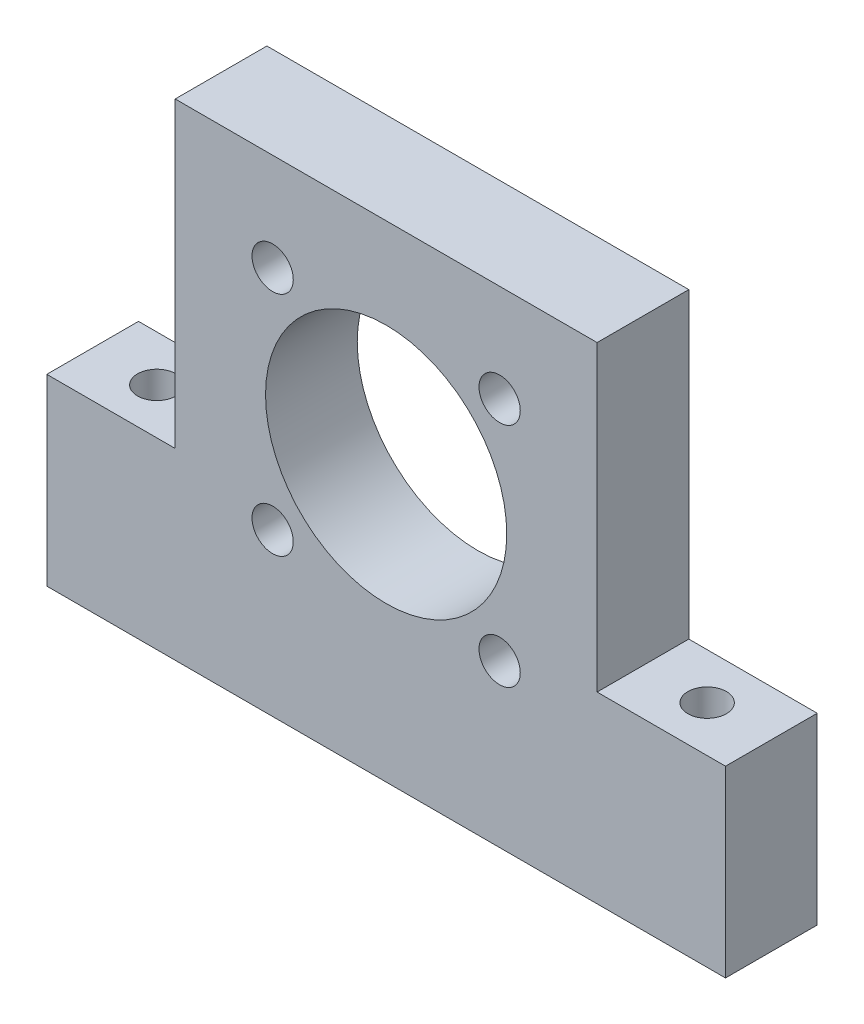
ISO-10303-21;
HEADER;
FILE_DESCRIPTION(('STEP AP214'),'2;1');
FILE_NAME('part.step','',(''),(''),'','','');
FILE_SCHEMA(('AUTOMOTIVE_DESIGN { 1 0 10303 214 1 1 1 1 }'));
ENDSEC;
DATA;
#1=APPLICATION_CONTEXT('core data for automotive mechanical design processes');
#2=APPLICATION_PROTOCOL_DEFINITION('international standard','automotive_design',2000,#1);
#3=PRODUCT_CONTEXT('',#1,'mechanical');
#4=PRODUCT('Part','Part','',(#3));
#5=PRODUCT_RELATED_PRODUCT_CATEGORY('part','',(#4));
#6=PRODUCT_DEFINITION_FORMATION('','',#4);
#7=PRODUCT_DEFINITION_CONTEXT('part definition',#1,'design');
#8=PRODUCT_DEFINITION('design','',#6,#7);
#9=PRODUCT_DEFINITION_SHAPE('','',#8);
#10=(LENGTH_UNIT() NAMED_UNIT(*) SI_UNIT(.MILLI.,.METRE.));
#11=(NAMED_UNIT(*) PLANE_ANGLE_UNIT() SI_UNIT($,.RADIAN.));
#12=(NAMED_UNIT(*) SI_UNIT($,.STERADIAN.) SOLID_ANGLE_UNIT());
#13=UNCERTAINTY_MEASURE_WITH_UNIT(LENGTH_MEASURE(1.E-05),#10,'distance_accuracy_value','');
#14=(GEOMETRIC_REPRESENTATION_CONTEXT(3) GLOBAL_UNCERTAINTY_ASSIGNED_CONTEXT((#13)) GLOBAL_UNIT_ASSIGNED_CONTEXT((#10,
#11,#12)) REPRESENTATION_CONTEXT('',''));
#15=CARTESIAN_POINT('',(0.,0.,0.));
#16=DIRECTION('',(0.,0.,1.));
#17=DIRECTION('',(1.,0.,0.));
#18=AXIS2_PLACEMENT_3D('',#15,#16,#17);
#19=CARTESIAN_POINT('',(0.,0.,10.));
#20=DIRECTION('',(0.,0.,-1.));
#21=DIRECTION('',(-1.,0.,0.));
#22=AXIS2_PLACEMENT_3D('',#19,#20,#21);
#23=PLANE('',#22);
#24=CARTESIAN_POINT('',(12.3743686707646,-12.3743686707646,10.));
#25=DIRECTION('',(0.,0.,1.));
#26=DIRECTION('',(0.,-1.,0.));
#27=AXIS2_PLACEMENT_3D('',#24,#25,#26);
#28=CIRCLE('',#27,2.25);
#29=CARTESIAN_POINT('',(12.3743686707646,-14.6243686707646,10.));
#30=VERTEX_POINT('',#29);
#31=EDGE_CURVE('E219',#30,#30,#28,.T.);
#32=ORIENTED_EDGE('',*,*,#31,.F.);
#33=EDGE_LOOP('',(#32));
#34=FACE_BOUND('',#33,.T.);
#35=CARTESIAN_POINT('',(-12.3743686707645,-12.3743686707647,10.));
#36=DIRECTION('',(0.,0.,1.));
#37=DIRECTION('',(-1.,0.,0.));
#38=AXIS2_PLACEMENT_3D('',#35,#36,#37);
#39=CIRCLE('',#38,2.25);
#40=CARTESIAN_POINT('',(-14.6243686707645,-12.3743686707647,10.));
#41=VERTEX_POINT('',#40);
#42=EDGE_CURVE('E213',#41,#41,#39,.T.);
#43=ORIENTED_EDGE('',*,*,#42,.F.);
#44=EDGE_LOOP('',(#43));
#45=FACE_BOUND('',#44,.T.);
#46=CARTESIAN_POINT('',(-12.3743686707645,12.3743686707646,10.));
#47=DIRECTION('',(0.,0.,1.));
#48=DIRECTION('',(0.,1.,0.));
#49=AXIS2_PLACEMENT_3D('',#46,#47,#48);
#50=CIRCLE('',#49,2.25);
#51=CARTESIAN_POINT('',(-12.3743686707645,14.6243686707646,10.));
#52=VERTEX_POINT('',#51);
#53=EDGE_CURVE('E207',#52,#52,#50,.T.);
#54=ORIENTED_EDGE('',*,*,#53,.F.);
#55=EDGE_LOOP('',(#54));
#56=FACE_BOUND('',#55,.T.);
#57=CARTESIAN_POINT('',(12.3743686707645,12.3743686707647,10.));
#58=DIRECTION('',(0.,0.,1.));
#59=DIRECTION('',(1.,0.,0.));
#60=AXIS2_PLACEMENT_3D('',#57,#58,#59);
#61=CIRCLE('',#60,2.25);
#62=CARTESIAN_POINT('',(14.6243686707645,12.3743686707647,10.));
#63=VERTEX_POINT('',#62);
#64=EDGE_CURVE('E201',#63,#63,#61,.T.);
#65=ORIENTED_EDGE('',*,*,#64,.F.);
#66=EDGE_LOOP('',(#65));
#67=FACE_BOUND('',#66,.T.);
#68=DIRECTION('',(0.,-1.,0.));
#69=VECTOR('',#68,1.);
#70=CARTESIAN_POINT('',(-23.,23.,10.));
#71=LINE('',#70,#69);
#72=CARTESIAN_POINT('',(-23.,23.,10.));
#73=VERTEX_POINT('',#72);
#74=CARTESIAN_POINT('',(-23.,-9.99999999999999,10.));
#75=VERTEX_POINT('',#74);
#76=EDGE_CURVE('E149',#73,#75,#71,.T.);
#77=ORIENTED_EDGE('',*,*,#76,.T.);
#78=DIRECTION('',(-1.,0.,0.));
#79=VECTOR('',#78,1.);
#80=CARTESIAN_POINT('',(-23.,-9.99999999999999,10.));
#81=LINE('',#80,#79);
#82=CARTESIAN_POINT('',(-37.,-9.99999999999999,10.));
#83=VERTEX_POINT('',#82);
#84=EDGE_CURVE('E97',#75,#83,#81,.T.);
#85=ORIENTED_EDGE('',*,*,#84,.T.);
#86=DIRECTION('',(0.,-1.,0.));
#87=VECTOR('',#86,1.);
#88=CARTESIAN_POINT('',(-37.,-9.99999999999999,10.));
#89=LINE('',#88,#87);
#90=CARTESIAN_POINT('',(-37.,-30.,10.));
#91=VERTEX_POINT('',#90);
#92=EDGE_CURVE('E164',#83,#91,#89,.T.);
#93=ORIENTED_EDGE('',*,*,#92,.T.);
#94=DIRECTION('',(1.,0.,0.));
#95=VECTOR('',#94,1.);
#96=CARTESIAN_POINT('',(-37.,-30.,10.));
#97=LINE('',#96,#95);
#98=CARTESIAN_POINT('',(37.,-30.,10.));
#99=VERTEX_POINT('',#98);
#100=EDGE_CURVE('E177',#91,#99,#97,.T.);
#101=ORIENTED_EDGE('',*,*,#100,.T.);
#102=DIRECTION('',(0.,1.,0.));
#103=VECTOR('',#102,1.);
#104=CARTESIAN_POINT('',(37.,-9.99999999999999,10.));
#105=LINE('',#104,#103);
#106=CARTESIAN_POINT('',(37.,-9.99999999999999,10.));
#107=VERTEX_POINT('',#106);
#108=EDGE_CURVE('E116',#99,#107,#105,.T.);
#109=ORIENTED_EDGE('',*,*,#108,.T.);
#110=DIRECTION('',(-1.,0.,0.));
#111=VECTOR('',#110,1.);
#112=CARTESIAN_POINT('',(23.,-9.99999999999999,10.));
#113=LINE('',#112,#111);
#114=CARTESIAN_POINT('',(23.,-9.99999999999999,10.));
#115=VERTEX_POINT('',#114);
#116=EDGE_CURVE('E110',#107,#115,#113,.T.);
#117=ORIENTED_EDGE('',*,*,#116,.T.);
#118=DIRECTION('',(0.,1.,0.));
#119=VECTOR('',#118,1.);
#120=CARTESIAN_POINT('',(23.,23.,10.));
#121=LINE('',#120,#119);
#122=CARTESIAN_POINT('',(23.,23.,10.));
#123=VERTEX_POINT('',#122);
#124=EDGE_CURVE('E114',#115,#123,#121,.T.);
#125=ORIENTED_EDGE('',*,*,#124,.T.);
#126=DIRECTION('',(-1.,0.,0.));
#127=VECTOR('',#126,1.);
#128=CARTESIAN_POINT('',(-23.,23.,10.));
#129=LINE('',#128,#127);
#130=EDGE_CURVE('E54',#123,#73,#129,.T.);
#131=ORIENTED_EDGE('',*,*,#130,.T.);
#132=EDGE_LOOP('',(#77,#85,#93,#101,#109,#117,#125,#131));
#133=FACE_BOUND('',#132,.T.);
#134=CARTESIAN_POINT('',(0.,0.,10.));
#135=DIRECTION('',(0.,0.,1.));
#136=DIRECTION('',(1.,0.,0.));
#137=AXIS2_PLACEMENT_3D('',#134,#135,#136);
#138=CIRCLE('',#137,13.15);
#139=CARTESIAN_POINT('',(13.15,0.,10.));
#140=VERTEX_POINT('',#139);
#141=EDGE_CURVE('E138',#140,#140,#138,.T.);
#142=ORIENTED_EDGE('',*,*,#141,.F.);
#143=EDGE_LOOP('',(#142));
#144=FACE_BOUND('',#143,.T.);
#145=ADVANCED_FACE('F37',(#34,#45,#56,#67,#133,#144),#23,.F.);
#146=CARTESIAN_POINT('',(0.,0.,0.));
#147=DIRECTION('',(0.,0.,-1.));
#148=DIRECTION('',(-1.,0.,0.));
#149=AXIS2_PLACEMENT_3D('',#146,#147,#148);
#150=PLANE('',#149);
#151=CARTESIAN_POINT('',(12.3743686707646,-12.3743686707646,0.));
#152=DIRECTION('',(0.,0.,1.));
#153=DIRECTION('',(0.,-1.,0.));
#154=AXIS2_PLACEMENT_3D('',#151,#152,#153);
#155=CIRCLE('',#154,2.25);
#156=CARTESIAN_POINT('',(12.3743686707646,-14.6243686707646,0.));
#157=VERTEX_POINT('',#156);
#158=EDGE_CURVE('E204',#157,#157,#155,.T.);
#159=ORIENTED_EDGE('',*,*,#158,.T.);
#160=EDGE_LOOP('',(#159));
#161=FACE_BOUND('',#160,.T.);
#162=CARTESIAN_POINT('',(-12.3743686707645,-12.3743686707647,0.));
#163=DIRECTION('',(0.,0.,1.));
#164=DIRECTION('',(-1.,0.,0.));
#165=AXIS2_PLACEMENT_3D('',#162,#163,#164);
#166=CIRCLE('',#165,2.25);
#167=CARTESIAN_POINT('',(-14.6243686707645,-12.3743686707647,0.));
#168=VERTEX_POINT('',#167);
#169=EDGE_CURVE('E216',#168,#168,#166,.T.);
#170=ORIENTED_EDGE('',*,*,#169,.T.);
#171=EDGE_LOOP('',(#170));
#172=FACE_BOUND('',#171,.T.);
#173=CARTESIAN_POINT('',(-12.3743686707645,12.3743686707646,0.));
#174=DIRECTION('',(0.,0.,1.));
#175=DIRECTION('',(0.,1.,0.));
#176=AXIS2_PLACEMENT_3D('',#173,#174,#175);
#177=CIRCLE('',#176,2.25);
#178=CARTESIAN_POINT('',(-12.3743686707645,14.6243686707646,0.));
#179=VERTEX_POINT('',#178);
#180=EDGE_CURVE('E210',#179,#179,#177,.T.);
#181=ORIENTED_EDGE('',*,*,#180,.T.);
#182=EDGE_LOOP('',(#181));
#183=FACE_BOUND('',#182,.T.);
#184=CARTESIAN_POINT('',(12.3743686707645,12.3743686707647,0.));
#185=DIRECTION('',(0.,0.,1.));
#186=DIRECTION('',(1.,0.,0.));
#187=AXIS2_PLACEMENT_3D('',#184,#185,#186);
#188=CIRCLE('',#187,2.25);
#189=CARTESIAN_POINT('',(14.6243686707645,12.3743686707647,0.));
#190=VERTEX_POINT('',#189);
#191=EDGE_CURVE('E196',#190,#190,#188,.T.);
#192=ORIENTED_EDGE('',*,*,#191,.T.);
#193=EDGE_LOOP('',(#192));
#194=FACE_BOUND('',#193,.T.);
#195=DIRECTION('',(0.,-1.,0.));
#196=VECTOR('',#195,1.);
#197=CARTESIAN_POINT('',(-23.,23.,0.));
#198=LINE('',#197,#196);
#199=CARTESIAN_POINT('',(-23.,23.,0.));
#200=VERTEX_POINT('',#199);
#201=CARTESIAN_POINT('',(-23.,-9.99999999999999,0.));
#202=VERTEX_POINT('',#201);
#203=EDGE_CURVE('E134',#200,#202,#198,.T.);
#204=ORIENTED_EDGE('',*,*,#203,.F.);
#205=DIRECTION('',(-1.,0.,0.));
#206=VECTOR('',#205,1.);
#207=CARTESIAN_POINT('',(-23.,23.,0.));
#208=LINE('',#207,#206);
#209=CARTESIAN_POINT('',(23.,23.,0.));
#210=VERTEX_POINT('',#209);
#211=EDGE_CURVE('E89',#210,#200,#208,.T.);
#212=ORIENTED_EDGE('',*,*,#211,.F.);
#213=DIRECTION('',(0.,1.,0.));
#214=VECTOR('',#213,1.);
#215=CARTESIAN_POINT('',(23.,23.,0.));
#216=LINE('',#215,#214);
#217=CARTESIAN_POINT('',(23.,-9.99999999999999,0.));
#218=VERTEX_POINT('',#217);
#219=EDGE_CURVE('E83',#218,#210,#216,.T.);
#220=ORIENTED_EDGE('',*,*,#219,.F.);
#221=DIRECTION('',(-1.,0.,0.));
#222=VECTOR('',#221,1.);
#223=CARTESIAN_POINT('',(23.,-9.99999999999999,0.));
#224=LINE('',#223,#222);
#225=CARTESIAN_POINT('',(37.,-9.99999999999999,0.));
#226=VERTEX_POINT('',#225);
#227=EDGE_CURVE('E124',#226,#218,#224,.T.);
#228=ORIENTED_EDGE('',*,*,#227,.F.);
#229=DIRECTION('',(0.,1.,0.));
#230=VECTOR('',#229,1.);
#231=CARTESIAN_POINT('',(37.,-9.99999999999999,0.));
#232=LINE('',#231,#230);
#233=CARTESIAN_POINT('',(37.,-30.,0.));
#234=VERTEX_POINT('',#233);
#235=EDGE_CURVE('E144',#234,#226,#232,.T.);
#236=ORIENTED_EDGE('',*,*,#235,.F.);
#237=DIRECTION('',(1.,0.,0.));
#238=VECTOR('',#237,1.);
#239=CARTESIAN_POINT('',(-37.,-30.,0.));
#240=LINE('',#239,#238);
#241=CARTESIAN_POINT('',(-37.,-30.,0.));
#242=VERTEX_POINT('',#241);
#243=EDGE_CURVE('E142',#242,#234,#240,.T.);
#244=ORIENTED_EDGE('',*,*,#243,.F.);
#245=DIRECTION('',(0.,-1.,0.));
#246=VECTOR('',#245,1.);
#247=CARTESIAN_POINT('',(-37.,-9.99999999999999,0.));
#248=LINE('',#247,#246);
#249=CARTESIAN_POINT('',(-37.,-9.99999999999999,0.));
#250=VERTEX_POINT('',#249);
#251=EDGE_CURVE('E140',#250,#242,#248,.T.);
#252=ORIENTED_EDGE('',*,*,#251,.F.);
#253=DIRECTION('',(-1.,0.,0.));
#254=VECTOR('',#253,1.);
#255=CARTESIAN_POINT('',(-23.,-9.99999999999999,0.));
#256=LINE('',#255,#254);
#257=EDGE_CURVE('E137',#202,#250,#256,.T.);
#258=ORIENTED_EDGE('',*,*,#257,.F.);
#259=EDGE_LOOP('',(#204,#212,#220,#228,#236,#244,#252,#258));
#260=FACE_BOUND('',#259,.T.);
#261=CARTESIAN_POINT('',(0.,0.,0.));
#262=DIRECTION('',(0.,0.,1.));
#263=DIRECTION('',(1.,0.,0.));
#264=AXIS2_PLACEMENT_3D('',#261,#262,#263);
#265=CIRCLE('',#264,13.15);
#266=CARTESIAN_POINT('',(13.15,0.,0.));
#267=VERTEX_POINT('',#266);
#268=EDGE_CURVE('E183',#267,#267,#265,.T.);
#269=ORIENTED_EDGE('',*,*,#268,.T.);
#270=EDGE_LOOP('',(#269));
#271=FACE_BOUND('',#270,.T.);
#272=ADVANCED_FACE('F168',(#161,#172,#183,#194,#260,#271),#150,.T.);
#273=CARTESIAN_POINT('',(-23.,23.,10.));
#274=DIRECTION('',(1.,0.,0.));
#275=DIRECTION('',(0.,1.,0.));
#276=AXIS2_PLACEMENT_3D('',#273,#274,#275);
#277=PLANE('',#276);
#278=ORIENTED_EDGE('',*,*,#203,.T.);
#279=DIRECTION('',(0.,0.,-1.));
#280=VECTOR('',#279,1.);
#281=CARTESIAN_POINT('',(-23.,-9.99999999999999,10.));
#282=LINE('',#281,#280);
#283=EDGE_CURVE('E11',#75,#202,#282,.T.);
#284=ORIENTED_EDGE('',*,*,#283,.F.);
#285=ORIENTED_EDGE('',*,*,#76,.F.);
#286=DIRECTION('',(0.,0.,-1.));
#287=VECTOR('',#286,1.);
#288=CARTESIAN_POINT('',(-23.,23.,10.));
#289=LINE('',#288,#287);
#290=EDGE_CURVE('E130',#73,#200,#289,.T.);
#291=ORIENTED_EDGE('',*,*,#290,.T.);
#292=EDGE_LOOP('',(#278,#284,#285,#291));
#293=FACE_BOUND('',#292,.T.);
#294=ADVANCED_FACE('F39',(#293),#277,.F.);
#295=CARTESIAN_POINT('',(-23.,-9.99999999999999,10.));
#296=DIRECTION('',(0.,-1.,0.));
#297=DIRECTION('',(0.,0.,-1.));
#298=AXIS2_PLACEMENT_3D('',#295,#296,#297);
#299=PLANE('',#298);
#300=CARTESIAN_POINT('',(-30.,-9.99999999999999,5.));
#301=DIRECTION('',(0.,-1.,0.));
#302=DIRECTION('',(0.,0.,-1.));
#303=AXIS2_PLACEMENT_3D('',#300,#301,#302);
#304=CIRCLE('',#303,2.1);
#305=CARTESIAN_POINT('',(-30.,-9.99999999999999,2.9));
#306=VERTEX_POINT('',#305);
#307=EDGE_CURVE('E186',#306,#306,#304,.F.);
#308=ORIENTED_EDGE('',*,*,#307,.F.);
#309=EDGE_LOOP('',(#308));
#310=FACE_BOUND('',#309,.T.);
#311=ORIENTED_EDGE('',*,*,#257,.T.);
#312=DIRECTION('',(0.,0.,-1.));
#313=VECTOR('',#312,1.);
#314=CARTESIAN_POINT('',(-37.,-9.99999999999999,10.));
#315=LINE('',#314,#313);
#316=EDGE_CURVE('E46',#83,#250,#315,.T.);
#317=ORIENTED_EDGE('',*,*,#316,.F.);
#318=ORIENTED_EDGE('',*,*,#84,.F.);
#319=ORIENTED_EDGE('',*,*,#283,.T.);
#320=EDGE_LOOP('',(#311,#317,#318,#319));
#321=FACE_BOUND('',#320,.T.);
#322=ADVANCED_FACE('F284',(#310,#321),#299,.F.);
#323=CARTESIAN_POINT('',(-37.,-9.99999999999999,10.));
#324=DIRECTION('',(1.,0.,0.));
#325=DIRECTION('',(0.,0.,-1.));
#326=AXIS2_PLACEMENT_3D('',#323,#324,#325);
#327=PLANE('',#326);
#328=ORIENTED_EDGE('',*,*,#251,.T.);
#329=DIRECTION('',(0.,0.,-1.));
#330=VECTOR('',#329,1.);
#331=CARTESIAN_POINT('',(-37.,-30.,10.));
#332=LINE('',#331,#330);
#333=EDGE_CURVE('E156',#91,#242,#332,.T.);
#334=ORIENTED_EDGE('',*,*,#333,.F.);
#335=ORIENTED_EDGE('',*,*,#92,.F.);
#336=ORIENTED_EDGE('',*,*,#316,.T.);
#337=EDGE_LOOP('',(#328,#334,#335,#336));
#338=FACE_BOUND('',#337,.T.);
#339=ADVANCED_FACE('F162',(#338),#327,.F.);
#340=CARTESIAN_POINT('',(-37.,-30.,10.));
#341=DIRECTION('',(0.,1.,0.));
#342=DIRECTION('',(0.,0.,1.));
#343=AXIS2_PLACEMENT_3D('',#340,#341,#342);
#344=PLANE('',#343);
#345=CARTESIAN_POINT('',(-30.,-30.,5.));
#346=DIRECTION('',(0.,-1.,0.));
#347=DIRECTION('',(0.,0.,-1.));
#348=AXIS2_PLACEMENT_3D('',#345,#346,#347);
#349=CIRCLE('',#348,2.1);
#350=CARTESIAN_POINT('',(-30.,-30.,2.9));
#351=VERTEX_POINT('',#350);
#352=EDGE_CURVE('E192',#351,#351,#349,.T.);
#353=ORIENTED_EDGE('',*,*,#352,.F.);
#354=EDGE_LOOP('',(#353));
#355=FACE_BOUND('',#354,.T.);
#356=CARTESIAN_POINT('',(30.,-30.,5.00000000000001));
#357=DIRECTION('',(0.,-1.,0.));
#358=DIRECTION('',(0.,0.,1.));
#359=AXIS2_PLACEMENT_3D('',#356,#357,#358);
#360=CIRCLE('',#359,2.1);
#361=CARTESIAN_POINT('',(30.,-30.,7.10000000000001));
#362=VERTEX_POINT('',#361);
#363=EDGE_CURVE('E189',#362,#362,#360,.T.);
#364=ORIENTED_EDGE('',*,*,#363,.F.);
#365=EDGE_LOOP('',(#364));
#366=FACE_BOUND('',#365,.T.);
#367=ORIENTED_EDGE('',*,*,#243,.T.);
#368=DIRECTION('',(0.,0.,-1.));
#369=VECTOR('',#368,1.);
#370=CARTESIAN_POINT('',(37.,-30.,10.));
#371=LINE('',#370,#369);
#372=EDGE_CURVE('E153',#99,#234,#371,.T.);
#373=ORIENTED_EDGE('',*,*,#372,.F.);
#374=ORIENTED_EDGE('',*,*,#100,.F.);
#375=ORIENTED_EDGE('',*,*,#333,.T.);
#376=EDGE_LOOP('',(#367,#373,#374,#375));
#377=FACE_BOUND('',#376,.T.);
#378=ADVANCED_FACE('F173',(#355,#366,#377),#344,.F.);
#379=CARTESIAN_POINT('',(37.,-9.99999999999999,10.));
#380=DIRECTION('',(-1.,0.,0.));
#381=DIRECTION('',(0.,0.,1.));
#382=AXIS2_PLACEMENT_3D('',#379,#380,#381);
#383=PLANE('',#382);
#384=ORIENTED_EDGE('',*,*,#235,.T.);
#385=DIRECTION('',(0.,0.,-1.));
#386=VECTOR('',#385,1.);
#387=CARTESIAN_POINT('',(37.,-9.99999999999999,10.));
#388=LINE('',#387,#386);
#389=EDGE_CURVE('E125',#107,#226,#388,.T.);
#390=ORIENTED_EDGE('',*,*,#389,.F.);
#391=ORIENTED_EDGE('',*,*,#108,.F.);
#392=ORIENTED_EDGE('',*,*,#372,.T.);
#393=EDGE_LOOP('',(#384,#390,#391,#392));
#394=FACE_BOUND('',#393,.T.);
#395=ADVANCED_FACE('F176',(#394),#383,.F.);
#396=CARTESIAN_POINT('',(23.,-9.99999999999999,10.));
#397=DIRECTION('',(0.,-1.,0.));
#398=DIRECTION('',(0.,0.,-1.));
#399=AXIS2_PLACEMENT_3D('',#396,#397,#398);
#400=PLANE('',#399);
#401=CARTESIAN_POINT('',(30.,-9.99999999999999,5.00000000000001));
#402=DIRECTION('',(0.,-1.,0.));
#403=DIRECTION('',(0.,0.,-1.));
#404=AXIS2_PLACEMENT_3D('',#401,#402,#403);
#405=CIRCLE('',#404,2.1);
#406=CARTESIAN_POINT('',(30.,-9.99999999999999,2.9));
#407=VERTEX_POINT('',#406);
#408=EDGE_CURVE('E193',#407,#407,#405,.F.);
#409=ORIENTED_EDGE('',*,*,#408,.F.);
#410=EDGE_LOOP('',(#409));
#411=FACE_BOUND('',#410,.T.);
#412=ORIENTED_EDGE('',*,*,#227,.T.);
#413=DIRECTION('',(0.,0.,-1.));
#414=VECTOR('',#413,1.);
#415=CARTESIAN_POINT('',(23.,-9.99999999999999,10.));
#416=LINE('',#415,#414);
#417=EDGE_CURVE('E121',#115,#218,#416,.T.);
#418=ORIENTED_EDGE('',*,*,#417,.F.);
#419=ORIENTED_EDGE('',*,*,#116,.F.);
#420=ORIENTED_EDGE('',*,*,#389,.T.);
#421=EDGE_LOOP('',(#412,#418,#419,#420));
#422=FACE_BOUND('',#421,.T.);
#423=ADVANCED_FACE('F122',(#411,#422),#400,.F.);
#424=CARTESIAN_POINT('',(23.,23.,10.));
#425=DIRECTION('',(-1.,0.,0.));
#426=DIRECTION('',(0.,-1.,0.));
#427=AXIS2_PLACEMENT_3D('',#424,#425,#426);
#428=PLANE('',#427);
#429=ORIENTED_EDGE('',*,*,#219,.T.);
#430=DIRECTION('',(0.,0.,-1.));
#431=VECTOR('',#430,1.);
#432=CARTESIAN_POINT('',(23.,23.,10.));
#433=LINE('',#432,#431);
#434=EDGE_CURVE('E126',#123,#210,#433,.T.);
#435=ORIENTED_EDGE('',*,*,#434,.F.);
#436=ORIENTED_EDGE('',*,*,#124,.F.);
#437=ORIENTED_EDGE('',*,*,#417,.T.);
#438=EDGE_LOOP('',(#429,#435,#436,#437));
#439=FACE_BOUND('',#438,.T.);
#440=ADVANCED_FACE('F128',(#439),#428,.F.);
#441=CARTESIAN_POINT('',(-23.,23.,10.));
#442=DIRECTION('',(0.,-1.,0.));
#443=DIRECTION('',(0.,0.,-1.));
#444=AXIS2_PLACEMENT_3D('',#441,#442,#443);
#445=PLANE('',#444);
#446=ORIENTED_EDGE('',*,*,#211,.T.);
#447=ORIENTED_EDGE('',*,*,#290,.F.);
#448=ORIENTED_EDGE('',*,*,#130,.F.);
#449=ORIENTED_EDGE('',*,*,#434,.T.);
#450=EDGE_LOOP('',(#446,#447,#448,#449));
#451=FACE_BOUND('',#450,.T.);
#452=ADVANCED_FACE('F266',(#451),#445,.F.);
#453=CARTESIAN_POINT('',(0.,0.,10.));
#454=DIRECTION('',(0.,0.,-1.));
#455=DIRECTION('',(-1.,0.,0.));
#456=AXIS2_PLACEMENT_3D('',#453,#454,#455);
#457=CYLINDRICAL_SURFACE('',#456,13.15);
#458=ORIENTED_EDGE('',*,*,#141,.T.);
#459=EDGE_LOOP('',(#458));
#460=FACE_BOUND('',#459,.T.);
#461=ORIENTED_EDGE('',*,*,#268,.F.);
#462=EDGE_LOOP('',(#461));
#463=FACE_BOUND('',#462,.T.);
#464=ADVANCED_FACE('F263',(#460,#463),#457,.F.);
#465=CARTESIAN_POINT('',(30.,23.001,5.00000000000001));
#466=DIRECTION('',(0.,-1.,0.));
#467=DIRECTION('',(0.,0.,-1.));
#468=AXIS2_PLACEMENT_3D('',#465,#466,#467);
#469=CYLINDRICAL_SURFACE('',#468,2.1);
#470=ORIENTED_EDGE('',*,*,#363,.T.);
#471=EDGE_LOOP('',(#470));
#472=FACE_BOUND('',#471,.T.);
#473=ORIENTED_EDGE('',*,*,#408,.T.);
#474=EDGE_LOOP('',(#473));
#475=FACE_BOUND('',#474,.T.);
#476=ADVANCED_FACE('F255',(#472,#475),#469,.F.);
#477=CARTESIAN_POINT('',(-30.,23.001,5.));
#478=DIRECTION('',(0.,-1.,0.));
#479=DIRECTION('',(0.,0.,-1.));
#480=AXIS2_PLACEMENT_3D('',#477,#478,#479);
#481=CYLINDRICAL_SURFACE('',#480,2.1);
#482=ORIENTED_EDGE('',*,*,#352,.T.);
#483=EDGE_LOOP('',(#482));
#484=FACE_BOUND('',#483,.T.);
#485=ORIENTED_EDGE('',*,*,#307,.T.);
#486=EDGE_LOOP('',(#485));
#487=FACE_BOUND('',#486,.T.);
#488=ADVANCED_FACE('F246',(#484,#487),#481,.F.);
#489=CARTESIAN_POINT('',(12.3743686707645,12.3743686707647,0.));
#490=DIRECTION('',(0.,0.,1.));
#491=DIRECTION('',(1.,0.,0.));
#492=AXIS2_PLACEMENT_3D('',#489,#490,#491);
#493=CYLINDRICAL_SURFACE('',#492,2.25);
#494=ORIENTED_EDGE('',*,*,#191,.F.);
#495=EDGE_LOOP('',(#494));
#496=FACE_BOUND('',#495,.T.);
#497=ORIENTED_EDGE('',*,*,#64,.T.);
#498=EDGE_LOOP('',(#497));
#499=FACE_BOUND('',#498,.T.);
#500=ADVANCED_FACE('F243',(#496,#499),#493,.F.);
#501=CARTESIAN_POINT('',(-12.3743686707645,12.3743686707646,0.));
#502=DIRECTION('',(0.,0.,1.));
#503=DIRECTION('',(1.,0.,0.));
#504=AXIS2_PLACEMENT_3D('',#501,#502,#503);
#505=CYLINDRICAL_SURFACE('',#504,2.25);
#506=ORIENTED_EDGE('',*,*,#180,.F.);
#507=EDGE_LOOP('',(#506));
#508=FACE_BOUND('',#507,.T.);
#509=ORIENTED_EDGE('',*,*,#53,.T.);
#510=EDGE_LOOP('',(#509));
#511=FACE_BOUND('',#510,.T.);
#512=ADVANCED_FACE('F245',(#508,#511),#505,.F.);
#513=CARTESIAN_POINT('',(-12.3743686707645,-12.3743686707647,0.));
#514=DIRECTION('',(0.,0.,1.));
#515=DIRECTION('',(1.,0.,0.));
#516=AXIS2_PLACEMENT_3D('',#513,#514,#515);
#517=CYLINDRICAL_SURFACE('',#516,2.25);
#518=ORIENTED_EDGE('',*,*,#169,.F.);
#519=EDGE_LOOP('',(#518));
#520=FACE_BOUND('',#519,.T.);
#521=ORIENTED_EDGE('',*,*,#42,.T.);
#522=EDGE_LOOP('',(#521));
#523=FACE_BOUND('',#522,.T.);
#524=ADVANCED_FACE('F230',(#520,#523),#517,.F.);
#525=CARTESIAN_POINT('',(12.3743686707646,-12.3743686707646,0.));
#526=DIRECTION('',(0.,0.,1.));
#527=DIRECTION('',(1.,0.,0.));
#528=AXIS2_PLACEMENT_3D('',#525,#526,#527);
#529=CYLINDRICAL_SURFACE('',#528,2.25);
#530=ORIENTED_EDGE('',*,*,#158,.F.);
#531=EDGE_LOOP('',(#530));
#532=FACE_BOUND('',#531,.T.);
#533=ORIENTED_EDGE('',*,*,#31,.T.);
#534=EDGE_LOOP('',(#533));
#535=FACE_BOUND('',#534,.T.);
#536=ADVANCED_FACE('F227',(#532,#535),#529,.F.);
#537=CLOSED_SHELL('',(#145,#272,#294,#322,#339,#378,#395,#423,#440,#452,#464,#476,#488,#500,
#512,#524,#536));
#538=MANIFOLD_SOLID_BREP('B2',#537);
#539=ADVANCED_BREP_SHAPE_REPRESENTATION('',(#18,#538),#14);
#540=SHAPE_DEFINITION_REPRESENTATION(#9,#539);
ENDSEC;
END-ISO-10303-21;
